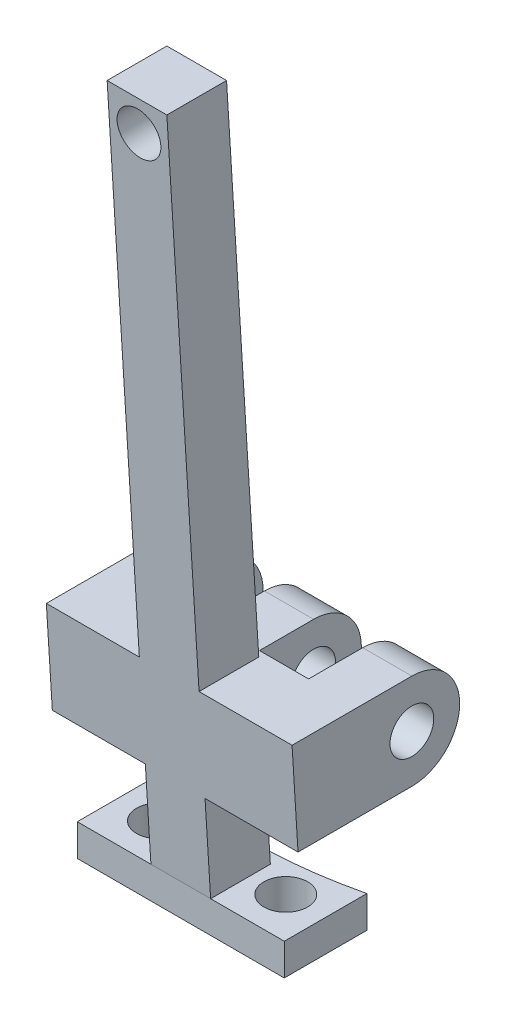
ISO-10303-21;
HEADER;
FILE_DESCRIPTION(('STEP AP214'),'2;1');
FILE_NAME('part.step','',(''),(''),'','','');
FILE_SCHEMA(('AUTOMOTIVE_DESIGN { 1 0 10303 214 1 1 1 1 }'));
ENDSEC;
DATA;
#1=APPLICATION_CONTEXT('core data for automotive mechanical design processes');
#2=APPLICATION_PROTOCOL_DEFINITION('international standard','automotive_design',2000,#1);
#3=PRODUCT_CONTEXT('',#1,'mechanical');
#4=PRODUCT('Part','Part','',(#3));
#5=PRODUCT_RELATED_PRODUCT_CATEGORY('part','',(#4));
#6=PRODUCT_DEFINITION_FORMATION('','',#4);
#7=PRODUCT_DEFINITION_CONTEXT('part definition',#1,'design');
#8=PRODUCT_DEFINITION('design','',#6,#7);
#9=PRODUCT_DEFINITION_SHAPE('','',#8);
#10=(LENGTH_UNIT() NAMED_UNIT(*) SI_UNIT(.MILLI.,.METRE.));
#11=(NAMED_UNIT(*) PLANE_ANGLE_UNIT() SI_UNIT($,.RADIAN.));
#12=(NAMED_UNIT(*) SI_UNIT($,.STERADIAN.) SOLID_ANGLE_UNIT());
#13=UNCERTAINTY_MEASURE_WITH_UNIT(LENGTH_MEASURE(1.E-05),#10,'distance_accuracy_value','');
#14=(GEOMETRIC_REPRESENTATION_CONTEXT(3) GLOBAL_UNCERTAINTY_ASSIGNED_CONTEXT((#13)) GLOBAL_UNIT_ASSIGNED_CONTEXT((#10,
#11,#12)) REPRESENTATION_CONTEXT('',''));
#15=CARTESIAN_POINT('',(0.,0.,0.));
#16=DIRECTION('',(0.,0.,1.));
#17=DIRECTION('',(1.,0.,0.));
#18=AXIS2_PLACEMENT_3D('',#15,#16,#17);
#19=CARTESIAN_POINT('',(7.28118293960535,13.63,-3.398125));
#20=DIRECTION('',(0.,0.,-1.));
#21=DIRECTION('',(0.,1.,0.));
#22=AXIS2_PLACEMENT_3D('',#19,#20,#21);
#23=PLANE('',#22);
#24=DIRECTION('',(-1.,0.,0.));
#25=VECTOR('',#24,1.);
#26=CARTESIAN_POINT('',(7.28118293960535,7.63,-3.398125));
#27=LINE('',#26,#25);
#28=CARTESIAN_POINT('',(1.875,7.63,-3.398125));
#29=VERTEX_POINT('',#28);
#30=CARTESIAN_POINT('',(1.543,7.63,-3.398125));
#31=VERTEX_POINT('',#30);
#32=EDGE_CURVE('E233',#29,#31,#27,.T.);
#33=ORIENTED_EDGE('',*,*,#32,.T.);
#34=DIRECTION('',(0.,1.,0.));
#35=VECTOR('',#34,1.);
#36=CARTESIAN_POINT('',(1.543,7.63,-3.398125));
#37=LINE('',#36,#35);
#38=CARTESIAN_POINT('',(1.543,13.63,-3.398125));
#39=VERTEX_POINT('',#38);
#40=EDGE_CURVE('E225',#31,#39,#37,.T.);
#41=ORIENTED_EDGE('',*,*,#40,.T.);
#42=DIRECTION('',(-1.,0.,0.));
#43=VECTOR('',#42,1.);
#44=CARTESIAN_POINT('',(7.28118293960535,13.63,-3.398125));
#45=LINE('',#44,#43);
#46=CARTESIAN_POINT('',(4.629,13.63,-3.398125));
#47=VERTEX_POINT('',#46);
#48=EDGE_CURVE('E81',#47,#39,#45,.T.);
#49=ORIENTED_EDGE('',*,*,#48,.F.);
#50=DIRECTION('',(0.,1.,0.));
#51=VECTOR('',#50,1.);
#52=CARTESIAN_POINT('',(4.629,7.63,-3.398125));
#53=LINE('',#52,#51);
#54=CARTESIAN_POINT('',(4.629,7.63,-3.398125));
#55=VERTEX_POINT('',#54);
#56=EDGE_CURVE('E538',#55,#47,#53,.T.);
#57=ORIENTED_EDGE('',*,*,#56,.F.);
#58=DIRECTION('',(1.,0.,0.));
#59=VECTOR('',#58,1.);
#60=CARTESIAN_POINT('',(-7.28118293960535,7.63,-3.398125));
#61=LINE('',#60,#59);
#62=EDGE_CURVE('E589',#29,#55,#61,.T.);
#63=ORIENTED_EDGE('',*,*,#62,.F.);
#64=EDGE_LOOP('',(#33,#41,#49,#57,#63));
#65=FACE_BOUND('',#64,.T.);
#66=ADVANCED_FACE('F55',(#65),#23,.T.);
#67=DIRECTION('',(0.,1.,0.));
#68=VECTOR('',#67,1.);
#69=CARTESIAN_POINT('',(-1.543,7.63,-3.398125));
#70=LINE('',#69,#68);
#71=CARTESIAN_POINT('',(-1.543,7.63,-3.398125));
#72=VERTEX_POINT('',#71);
#73=CARTESIAN_POINT('',(-1.543,13.63,-3.398125));
#74=VERTEX_POINT('',#73);
#75=EDGE_CURVE('E73',#72,#74,#70,.T.);
#76=ORIENTED_EDGE('',*,*,#75,.F.);
#77=CARTESIAN_POINT('',(-1.875,7.63,-3.398125));
#78=VERTEX_POINT('',#77);
#79=EDGE_CURVE('E610',#72,#78,#27,.T.);
#80=ORIENTED_EDGE('',*,*,#79,.T.);
#81=CARTESIAN_POINT('',(-4.629,7.63,-3.398125));
#82=VERTEX_POINT('',#81);
#83=EDGE_CURVE('E607',#78,#82,#27,.T.);
#84=ORIENTED_EDGE('',*,*,#83,.T.);
#85=DIRECTION('',(0.,1.,0.));
#86=VECTOR('',#85,1.);
#87=CARTESIAN_POINT('',(-4.629,7.63,-3.398125));
#88=LINE('',#87,#86);
#89=CARTESIAN_POINT('',(-4.629,13.63,-3.398125));
#90=VERTEX_POINT('',#89);
#91=EDGE_CURVE('E560',#82,#90,#88,.T.);
#92=ORIENTED_EDGE('',*,*,#91,.T.);
#93=EDGE_CURVE('E241',#74,#90,#45,.T.);
#94=ORIENTED_EDGE('',*,*,#93,.F.);
#95=EDGE_LOOP('',(#76,#80,#84,#92,#94));
#96=FACE_BOUND('',#95,.T.);
#97=ADVANCED_FACE('F322',(#96),#23,.T.);
#98=CARTESIAN_POINT('',(0.,0.24124513618677,-3.85992217898833));
#99=DIRECTION('',(0.,-0.0623782861551805,0.998052578482889));
#100=DIRECTION('',(0.,-0.998052578482889,-0.0623782861551805));
#101=AXIS2_PLACEMENT_3D('',#98,#99,#100);
#102=PLANE('',#101);
#103=ORIENTED_EDGE('',*,*,#32,.F.);
#104=DIRECTION('',(0.,0.998052578482889,0.0623782861551805));
#105=VECTOR('',#104,1.);
#106=CARTESIAN_POINT('',(1.875,2.,-3.75));
#107=LINE('',#106,#105);
#108=CARTESIAN_POINT('',(1.875,2.,-3.75));
#109=VERTEX_POINT('',#108);
#110=EDGE_CURVE('E260',#109,#29,#107,.T.);
#111=ORIENTED_EDGE('',*,*,#110,.F.);
#112=DIRECTION('',(-1.,0.,0.));
#113=VECTOR('',#112,1.);
#114=CARTESIAN_POINT('',(-1.875,2.,-3.75));
#115=LINE('',#114,#113);
#116=CARTESIAN_POINT('',(-1.875,2.,-3.75));
#117=VERTEX_POINT('',#116);
#118=EDGE_CURVE('E403',#109,#117,#115,.T.);
#119=ORIENTED_EDGE('',*,*,#118,.T.);
#120=DIRECTION('',(0.,0.998052578482889,0.0623782861551805));
#121=VECTOR('',#120,1.);
#122=CARTESIAN_POINT('',(-1.875,2.,-3.75));
#123=LINE('',#122,#121);
#124=EDGE_CURVE('E267',#117,#78,#123,.T.);
#125=ORIENTED_EDGE('',*,*,#124,.T.);
#126=ORIENTED_EDGE('',*,*,#79,.F.);
#127=DIRECTION('',(-1.,0.,0.));
#128=VECTOR('',#127,1.);
#129=CARTESIAN_POINT('',(1.543,7.63,-3.398125));
#130=LINE('',#129,#128);
#131=EDGE_CURVE('E529',#31,#72,#130,.T.);
#132=ORIENTED_EDGE('',*,*,#131,.F.);
#133=EDGE_LOOP('',(#103,#111,#119,#125,#126,#132));
#134=FACE_BOUND('',#133,.T.);
#135=ADVANCED_FACE('F317',(#134),#102,.F.);
#136=CARTESIAN_POINT('',(0.,44.,-1.125));
#137=DIRECTION('',(0.,-0.0623782861551805,0.998052578482889));
#138=DIRECTION('',(0.,0.998052578482889,0.0623782861551805));
#139=AXIS2_PLACEMENT_3D('',#136,#137,#138);
#140=ELLIPSE('',#139,1.37768292938043,1.375);
#141=CARTESIAN_POINT('',(0.,45.375,-1.0390625));
#142=VERTEX_POINT('',#141);
#143=EDGE_CURVE('E256',#142,#142,#140,.T.);
#144=ORIENTED_EDGE('',*,*,#143,.T.);
#145=EDGE_LOOP('',(#144));
#146=FACE_BOUND('',#145,.T.);
#147=CARTESIAN_POINT('',(1.875,13.63,-3.023125));
#148=VERTEX_POINT('',#147);
#149=CARTESIAN_POINT('',(1.875,46.,-1.));
#150=VERTEX_POINT('',#149);
#151=EDGE_CURVE('E264',#148,#150,#107,.T.);
#152=ORIENTED_EDGE('',*,*,#151,.F.);
#153=DIRECTION('',(-1.,0.,0.));
#154=VECTOR('',#153,1.);
#155=CARTESIAN_POINT('',(0.,13.63,-3.023125));
#156=LINE('',#155,#154);
#157=CARTESIAN_POINT('',(-1.875,13.63,-3.023125));
#158=VERTEX_POINT('',#157);
#159=EDGE_CURVE('E240',#148,#158,#156,.T.);
#160=ORIENTED_EDGE('',*,*,#159,.T.);
#161=CARTESIAN_POINT('',(-1.875,46.,-1.));
#162=VERTEX_POINT('',#161);
#163=EDGE_CURVE('E272',#158,#162,#123,.T.);
#164=ORIENTED_EDGE('',*,*,#163,.T.);
#165=DIRECTION('',(-1.,0.,0.));
#166=VECTOR('',#165,1.);
#167=CARTESIAN_POINT('',(-1.875,46.,-1.));
#168=LINE('',#167,#166);
#169=EDGE_CURVE('E343',#150,#162,#168,.T.);
#170=ORIENTED_EDGE('',*,*,#169,.F.);
#171=EDGE_LOOP('',(#152,#160,#164,#170));
#172=FACE_BOUND('',#171,.T.);
#173=ADVANCED_FACE('F321',(#146,#172),#102,.F.);
#174=CARTESIAN_POINT('',(1.875,0.,0.));
#175=DIRECTION('',(-1.,0.,0.));
#176=DIRECTION('',(0.,0.,1.));
#177=AXIS2_PLACEMENT_3D('',#174,#175,#176);
#178=PLANE('',#177);
#179=DIRECTION('',(0.,0.,-1.));
#180=VECTOR('',#179,1.);
#181=CARTESIAN_POINT('',(1.875,7.63,0.));
#182=LINE('',#181,#180);
#183=CARTESIAN_POINT('',(1.875,7.63,0.351875));
#184=VERTEX_POINT('',#183);
#185=EDGE_CURVE('E597',#184,#29,#182,.T.);
#186=ORIENTED_EDGE('',*,*,#185,.F.);
#187=DIRECTION('',(0.,0.998052578482889,0.0623782861551805));
#188=VECTOR('',#187,1.);
#189=CARTESIAN_POINT('',(1.875,2.,0.));
#190=LINE('',#189,#188);
#191=CARTESIAN_POINT('',(1.87499999999999,2.,0.));
#192=VERTEX_POINT('',#191);
#193=EDGE_CURVE('E271',#192,#184,#190,.T.);
#194=ORIENTED_EDGE('',*,*,#193,.F.);
#195=DIRECTION('',(0.,0.,-1.));
#196=VECTOR('',#195,1.);
#197=CARTESIAN_POINT('',(1.875,2.,0.));
#198=LINE('',#197,#196);
#199=EDGE_CURVE('E405',#192,#109,#198,.T.);
#200=ORIENTED_EDGE('',*,*,#199,.T.);
#201=ORIENTED_EDGE('',*,*,#110,.T.);
#202=EDGE_LOOP('',(#186,#194,#200,#201));
#203=FACE_BOUND('',#202,.T.);
#204=ADVANCED_FACE('F376',(#203),#178,.F.);
#205=DIRECTION('',(0.,0.,1.));
#206=VECTOR('',#205,1.);
#207=CARTESIAN_POINT('',(1.875,13.63,0.));
#208=LINE('',#207,#206);
#209=CARTESIAN_POINT('',(1.875,13.63,0.726875));
#210=VERTEX_POINT('',#209);
#211=EDGE_CURVE('E592',#148,#210,#208,.T.);
#212=ORIENTED_EDGE('',*,*,#211,.F.);
#213=ORIENTED_EDGE('',*,*,#151,.T.);
#214=DIRECTION('',(0.,0.,-1.));
#215=VECTOR('',#214,1.);
#216=CARTESIAN_POINT('',(1.875,46.,2.75));
#217=LINE('',#216,#215);
#218=CARTESIAN_POINT('',(1.875,46.,2.75));
#219=VERTEX_POINT('',#218);
#220=EDGE_CURVE('E346',#219,#150,#217,.T.);
#221=ORIENTED_EDGE('',*,*,#220,.F.);
#222=EDGE_CURVE('E59',#210,#219,#190,.T.);
#223=ORIENTED_EDGE('',*,*,#222,.F.);
#224=EDGE_LOOP('',(#212,#213,#221,#223));
#225=FACE_BOUND('',#224,.T.);
#226=ADVANCED_FACE('F436',(#225),#178,.F.);
#227=CARTESIAN_POINT('',(-1.875,0.,0.));
#228=DIRECTION('',(1.,0.,0.));
#229=DIRECTION('',(0.,0.,-1.));
#230=AXIS2_PLACEMENT_3D('',#227,#228,#229);
#231=PLANE('',#230);
#232=DIRECTION('',(0.,0.998052578482889,0.0623782861551805));
#233=VECTOR('',#232,1.);
#234=CARTESIAN_POINT('',(-1.875,2.,0.));
#235=LINE('',#234,#233);
#236=CARTESIAN_POINT('',(-1.875,2.,0.));
#237=VERTEX_POINT('',#236);
#238=CARTESIAN_POINT('',(-1.875,7.63,0.351875));
#239=VERTEX_POINT('',#238);
#240=EDGE_CURVE('E274',#237,#239,#235,.T.);
#241=ORIENTED_EDGE('',*,*,#240,.T.);
#242=DIRECTION('',(0.,0.,-1.));
#243=VECTOR('',#242,1.);
#244=CARTESIAN_POINT('',(-1.875,7.63,0.));
#245=LINE('',#244,#243);
#246=EDGE_CURVE('E252',#239,#78,#245,.T.);
#247=ORIENTED_EDGE('',*,*,#246,.T.);
#248=ORIENTED_EDGE('',*,*,#124,.F.);
#249=DIRECTION('',(0.,0.,1.));
#250=VECTOR('',#249,1.);
#251=CARTESIAN_POINT('',(-1.875,2.,-3.75));
#252=LINE('',#251,#250);
#253=EDGE_CURVE('E259',#117,#237,#252,.T.);
#254=ORIENTED_EDGE('',*,*,#253,.T.);
#255=EDGE_LOOP('',(#241,#247,#248,#254));
#256=FACE_BOUND('',#255,.T.);
#257=ADVANCED_FACE('F314',(#256),#231,.F.);
#258=CARTESIAN_POINT('',(6.5,2.,0.));
#259=DIRECTION('',(-1.,0.,0.));
#260=DIRECTION('',(0.,0.,1.));
#261=AXIS2_PLACEMENT_3D('',#258,#259,#260);
#262=PLANE('',#261);
#263=DIRECTION('',(0.,0.,-1.));
#264=VECTOR('',#263,1.);
#265=CARTESIAN_POINT('',(6.5,0.,0.));
#266=LINE('',#265,#264);
#267=CARTESIAN_POINT('',(6.5,0.,0.));
#268=VERTEX_POINT('',#267);
#269=CARTESIAN_POINT('',(6.5,0.,-5.19));
#270=VERTEX_POINT('',#269);
#271=EDGE_CURVE('E671',#268,#270,#266,.T.);
#272=ORIENTED_EDGE('',*,*,#271,.T.);
#273=DIRECTION('',(0.,-1.,0.));
#274=VECTOR('',#273,1.);
#275=CARTESIAN_POINT('',(6.5,2.,-5.19));
#276=LINE('',#275,#274);
#277=CARTESIAN_POINT('',(6.5,2.,-5.19));
#278=VERTEX_POINT('',#277);
#279=EDGE_CURVE('E12',#278,#270,#276,.T.);
#280=ORIENTED_EDGE('',*,*,#279,.F.);
#281=DIRECTION('',(0.,0.,-1.));
#282=VECTOR('',#281,1.);
#283=CARTESIAN_POINT('',(6.5,2.,0.));
#284=LINE('',#283,#282);
#285=CARTESIAN_POINT('',(6.5,2.,0.));
#286=VERTEX_POINT('',#285);
#287=EDGE_CURVE('E686',#286,#278,#284,.T.);
#288=ORIENTED_EDGE('',*,*,#287,.F.);
#289=DIRECTION('',(0.,-1.,0.));
#290=VECTOR('',#289,1.);
#291=CARTESIAN_POINT('',(6.5,2.,0.));
#292=LINE('',#291,#290);
#293=EDGE_CURVE('E659',#286,#268,#292,.T.);
#294=ORIENTED_EDGE('',*,*,#293,.T.);
#295=EDGE_LOOP('',(#272,#280,#288,#294));
#296=FACE_BOUND('',#295,.T.);
#297=ADVANCED_FACE('F57',(#296),#262,.F.);
#298=CARTESIAN_POINT('',(6.5,2.,-5.19));
#299=CARTESIAN_POINT('',(0.,2.,-3.63));
#300=CARTESIAN_POINT('',(-6.5,2.,-5.19));
#301=B_SPLINE_CURVE_WITH_KNOTS('',2,(#298,#299,#300),.UNSPECIFIED.,.F.,.F.,(3,3),(0.,1.),.UNSPECIFIED.);
#302=DIRECTION('',(0.,-1.,0.));
#303=VECTOR('',#302,1.);
#304=SURFACE_OF_LINEAR_EXTRUSION('',#301,#303);
#305=CARTESIAN_POINT('',(6.5,0.,-5.19));
#306=CARTESIAN_POINT('',(0.,0.,-3.63));
#307=CARTESIAN_POINT('',(-6.5,0.,-5.19));
#308=B_SPLINE_CURVE_WITH_KNOTS('',2,(#305,#306,#307),.UNSPECIFIED.,.F.,.F.,(3,3),(0.,1.),.UNSPECIFIED.);
#309=CARTESIAN_POINT('',(-6.5,0.,-5.19));
#310=VERTEX_POINT('',#309);
#311=EDGE_CURVE('E675',#270,#310,#308,.T.);
#312=ORIENTED_EDGE('',*,*,#311,.T.);
#313=DIRECTION('',(0.,-1.,0.));
#314=VECTOR('',#313,1.);
#315=CARTESIAN_POINT('',(-6.5,2.,-5.19));
#316=LINE('',#315,#314);
#317=CARTESIAN_POINT('',(-6.5,2.,-5.19));
#318=VERTEX_POINT('',#317);
#319=EDGE_CURVE('E65',#318,#310,#316,.T.);
#320=ORIENTED_EDGE('',*,*,#319,.F.);
#321=EDGE_CURVE('E665',#278,#318,#301,.T.);
#322=ORIENTED_EDGE('',*,*,#321,.F.);
#323=ORIENTED_EDGE('',*,*,#279,.T.);
#324=EDGE_LOOP('',(#312,#320,#322,#323));
#325=FACE_BOUND('',#324,.T.);
#326=ADVANCED_FACE('F713',(#325),#304,.F.);
#327=CARTESIAN_POINT('',(-6.5,2.,0.));
#328=DIRECTION('',(1.,0.,0.));
#329=DIRECTION('',(0.,0.,-1.));
#330=AXIS2_PLACEMENT_3D('',#327,#328,#329);
#331=PLANE('',#330);
#332=DIRECTION('',(0.,0.,1.));
#333=VECTOR('',#332,1.);
#334=CARTESIAN_POINT('',(-6.5,0.,0.));
#335=LINE('',#334,#333);
#336=CARTESIAN_POINT('',(-6.5,0.,0.));
#337=VERTEX_POINT('',#336);
#338=EDGE_CURVE('E679',#310,#337,#335,.T.);
#339=ORIENTED_EDGE('',*,*,#338,.T.);
#340=DIRECTION('',(0.,-1.,0.));
#341=VECTOR('',#340,1.);
#342=CARTESIAN_POINT('',(-6.5,2.,0.));
#343=LINE('',#342,#341);
#344=CARTESIAN_POINT('',(-6.5,2.,0.));
#345=VERTEX_POINT('',#344);
#346=EDGE_CURVE('E688',#345,#337,#343,.T.);
#347=ORIENTED_EDGE('',*,*,#346,.F.);
#348=DIRECTION('',(0.,0.,1.));
#349=VECTOR('',#348,1.);
#350=CARTESIAN_POINT('',(-6.5,2.,0.));
#351=LINE('',#350,#349);
#352=EDGE_CURVE('E662',#318,#345,#351,.T.);
#353=ORIENTED_EDGE('',*,*,#352,.F.);
#354=ORIENTED_EDGE('',*,*,#319,.T.);
#355=EDGE_LOOP('',(#339,#347,#353,#354));
#356=FACE_BOUND('',#355,.T.);
#357=ADVANCED_FACE('F695',(#356),#331,.F.);
#358=CARTESIAN_POINT('',(-6.5,2.,0.));
#359=DIRECTION('',(0.,0.,-1.));
#360=DIRECTION('',(-1.,0.,0.));
#361=AXIS2_PLACEMENT_3D('',#358,#359,#360);
#362=PLANE('',#361);
#363=DIRECTION('',(1.,0.,0.));
#364=VECTOR('',#363,1.);
#365=CARTESIAN_POINT('',(-6.5,0.,0.));
#366=LINE('',#365,#364);
#367=EDGE_CURVE('E684',#337,#268,#366,.T.);
#368=ORIENTED_EDGE('',*,*,#367,.T.);
#369=ORIENTED_EDGE('',*,*,#293,.F.);
#370=DIRECTION('',(1.,0.,0.));
#371=VECTOR('',#370,1.);
#372=CARTESIAN_POINT('',(-6.5,2.,0.));
#373=LINE('',#372,#371);
#374=EDGE_CURVE('E657',#192,#286,#373,.T.);
#375=ORIENTED_EDGE('',*,*,#374,.F.);
#376=DIRECTION('',(1.,0.,0.));
#377=VECTOR('',#376,1.);
#378=CARTESIAN_POINT('',(-1.875,2.,0.));
#379=LINE('',#378,#377);
#380=EDGE_CURVE('E411',#237,#192,#379,.T.);
#381=ORIENTED_EDGE('',*,*,#380,.F.);
#382=EDGE_CURVE('E651',#345,#237,#373,.T.);
#383=ORIENTED_EDGE('',*,*,#382,.F.);
#384=ORIENTED_EDGE('',*,*,#346,.T.);
#385=EDGE_LOOP('',(#368,#369,#375,#381,#383,#384));
#386=FACE_BOUND('',#385,.T.);
#387=ADVANCED_FACE('F654',(#386),#362,.F.);
#388=CARTESIAN_POINT('',(0.,2.,-4.41));
#389=DIRECTION('',(0.,-1.,0.));
#390=DIRECTION('',(0.,0.,-1.));
#391=AXIS2_PLACEMENT_3D('',#388,#389,#390);
#392=PLANE('',#391);
#393=CARTESIAN_POINT('',(-4.,2.,-2.595));
#394=DIRECTION('',(0.,1.,0.));
#395=DIRECTION('',(0.,0.,1.));
#396=AXIS2_PLACEMENT_3D('',#393,#394,#395);
#397=CIRCLE('',#396,1.375);
#398=CARTESIAN_POINT('',(-4.,2.,-1.22));
#399=VERTEX_POINT('',#398);
#400=EDGE_CURVE('E739',#399,#399,#397,.T.);
#401=ORIENTED_EDGE('',*,*,#400,.F.);
#402=EDGE_LOOP('',(#401));
#403=FACE_BOUND('',#402,.T.);
#404=CARTESIAN_POINT('',(4.,2.,-2.595));
#405=DIRECTION('',(0.,1.,0.));
#406=DIRECTION('',(0.,0.,1.));
#407=AXIS2_PLACEMENT_3D('',#404,#405,#406);
#408=CIRCLE('',#407,1.375);
#409=CARTESIAN_POINT('',(4.,2.,-1.22));
#410=VERTEX_POINT('',#409);
#411=EDGE_CURVE('E737',#410,#410,#408,.T.);
#412=ORIENTED_EDGE('',*,*,#411,.F.);
#413=EDGE_LOOP('',(#412));
#414=FACE_BOUND('',#413,.T.);
#415=ORIENTED_EDGE('',*,*,#382,.T.);
#416=ORIENTED_EDGE('',*,*,#253,.F.);
#417=ORIENTED_EDGE('',*,*,#118,.F.);
#418=ORIENTED_EDGE('',*,*,#199,.F.);
#419=ORIENTED_EDGE('',*,*,#374,.T.);
#420=ORIENTED_EDGE('',*,*,#287,.T.);
#421=ORIENTED_EDGE('',*,*,#321,.T.);
#422=ORIENTED_EDGE('',*,*,#352,.T.);
#423=EDGE_LOOP('',(#415,#416,#417,#418,#419,#420,#421,#422));
#424=FACE_BOUND('',#423,.T.);
#425=ADVANCED_FACE('F648',(#403,#414,#424),#392,.F.);
#426=CARTESIAN_POINT('',(0.,0.,-4.41));
#427=DIRECTION('',(0.,-1.,0.));
#428=DIRECTION('',(0.,0.,-1.));
#429=AXIS2_PLACEMENT_3D('',#426,#427,#428);
#430=PLANE('',#429);
#431=CARTESIAN_POINT('',(-4.,0.,-2.595));
#432=DIRECTION('',(0.,1.,0.));
#433=DIRECTION('',(0.,0.,1.));
#434=AXIS2_PLACEMENT_3D('',#431,#432,#433);
#435=CIRCLE('',#434,1.375);
#436=CARTESIAN_POINT('',(-4.,0.,-1.22));
#437=VERTEX_POINT('',#436);
#438=EDGE_CURVE('E365',#437,#437,#435,.T.);
#439=ORIENTED_EDGE('',*,*,#438,.T.);
#440=EDGE_LOOP('',(#439));
#441=FACE_BOUND('',#440,.T.);
#442=CARTESIAN_POINT('',(4.,0.,-2.595));
#443=DIRECTION('',(0.,1.,0.));
#444=DIRECTION('',(0.,0.,1.));
#445=AXIS2_PLACEMENT_3D('',#442,#443,#444);
#446=CIRCLE('',#445,1.375);
#447=CARTESIAN_POINT('',(4.,0.,-1.22));
#448=VERTEX_POINT('',#447);
#449=EDGE_CURVE('E394',#448,#448,#446,.T.);
#450=ORIENTED_EDGE('',*,*,#449,.T.);
#451=EDGE_LOOP('',(#450));
#452=FACE_BOUND('',#451,.T.);
#453=ORIENTED_EDGE('',*,*,#271,.F.);
#454=ORIENTED_EDGE('',*,*,#367,.F.);
#455=ORIENTED_EDGE('',*,*,#338,.F.);
#456=ORIENTED_EDGE('',*,*,#311,.F.);
#457=EDGE_LOOP('',(#453,#454,#455,#456));
#458=FACE_BOUND('',#457,.T.);
#459=ADVANCED_FACE('F701',(#441,#452,#458),#430,.T.);
#460=CARTESIAN_POINT('',(4.,0.,-2.595));
#461=DIRECTION('',(0.,1.,0.));
#462=DIRECTION('',(0.,0.,1.));
#463=AXIS2_PLACEMENT_3D('',#460,#461,#462);
#464=CYLINDRICAL_SURFACE('',#463,1.375);
#465=ORIENTED_EDGE('',*,*,#449,.F.);
#466=EDGE_LOOP('',(#465));
#467=FACE_BOUND('',#466,.T.);
#468=ORIENTED_EDGE('',*,*,#411,.T.);
#469=EDGE_LOOP('',(#468));
#470=FACE_BOUND('',#469,.T.);
#471=ADVANCED_FACE('F722',(#467,#470),#464,.F.);
#472=CARTESIAN_POINT('',(-4.,0.,-2.595));
#473=DIRECTION('',(0.,1.,0.));
#474=DIRECTION('',(0.,0.,1.));
#475=AXIS2_PLACEMENT_3D('',#472,#473,#474);
#476=CYLINDRICAL_SURFACE('',#475,1.375);
#477=ORIENTED_EDGE('',*,*,#438,.F.);
#478=EDGE_LOOP('',(#477));
#479=FACE_BOUND('',#478,.T.);
#480=ORIENTED_EDGE('',*,*,#400,.T.);
#481=EDGE_LOOP('',(#480));
#482=FACE_BOUND('',#481,.T.);
#483=ADVANCED_FACE('F375',(#479,#482),#476,.F.);
#484=CARTESIAN_POINT('',(0.,46.,0.));
#485=DIRECTION('',(0.,1.,0.));
#486=DIRECTION('',(0.,0.,1.));
#487=AXIS2_PLACEMENT_3D('',#484,#485,#486);
#488=PLANE('',#487);
#489=DIRECTION('',(1.,0.,0.));
#490=VECTOR('',#489,1.);
#491=CARTESIAN_POINT('',(-1.875,46.,2.75));
#492=LINE('',#491,#490);
#493=CARTESIAN_POINT('',(-1.875,46.,2.75));
#494=VERTEX_POINT('',#493);
#495=EDGE_CURVE('E263',#494,#219,#492,.T.);
#496=ORIENTED_EDGE('',*,*,#495,.T.);
#497=ORIENTED_EDGE('',*,*,#220,.T.);
#498=ORIENTED_EDGE('',*,*,#169,.T.);
#499=DIRECTION('',(0.,0.,1.));
#500=VECTOR('',#499,1.);
#501=CARTESIAN_POINT('',(-1.875,46.,-1.));
#502=LINE('',#501,#500);
#503=EDGE_CURVE('E294',#162,#494,#502,.T.);
#504=ORIENTED_EDGE('',*,*,#503,.T.);
#505=EDGE_LOOP('',(#496,#497,#498,#504));
#506=FACE_BOUND('',#505,.T.);
#507=ADVANCED_FACE('F313',(#506),#488,.T.);
#508=ORIENTED_EDGE('',*,*,#163,.F.);
#509=DIRECTION('',(0.,0.,1.));
#510=VECTOR('',#509,1.);
#511=CARTESIAN_POINT('',(-1.875,13.63,0.));
#512=LINE('',#511,#510);
#513=CARTESIAN_POINT('',(-1.875,13.63,0.726875));
#514=VERTEX_POINT('',#513);
#515=EDGE_CURVE('E244',#158,#514,#512,.T.);
#516=ORIENTED_EDGE('',*,*,#515,.T.);
#517=EDGE_CURVE('E275',#514,#494,#235,.T.);
#518=ORIENTED_EDGE('',*,*,#517,.T.);
#519=ORIENTED_EDGE('',*,*,#503,.F.);
#520=EDGE_LOOP('',(#508,#516,#518,#519));
#521=FACE_BOUND('',#520,.T.);
#522=ADVANCED_FACE('F302',(#521),#231,.F.);
#523=CARTESIAN_POINT('',(0.,0.00778210116731518,-0.124513618677043));
#524=DIRECTION('',(0.,0.0623782861551805,-0.998052578482889));
#525=DIRECTION('',(0.,0.998052578482889,0.0623782861551805));
#526=AXIS2_PLACEMENT_3D('',#523,#524,#525);
#527=PLANE('',#526);
#528=ORIENTED_EDGE('',*,*,#193,.T.);
#529=DIRECTION('',(1.,0.,0.));
#530=VECTOR('',#529,1.);
#531=CARTESIAN_POINT('',(-7.28118293960535,7.63,0.351874999999999));
#532=LINE('',#531,#530);
#533=CARTESIAN_POINT('',(7.715,7.63,0.351875000000001));
#534=VERTEX_POINT('',#533);
#535=EDGE_CURVE('E593',#184,#534,#532,.T.);
#536=ORIENTED_EDGE('',*,*,#535,.T.);
#537=DIRECTION('',(0.,0.998052578482889,0.0623782861551805));
#538=VECTOR('',#537,1.);
#539=CARTESIAN_POINT('',(7.715,7.63,0.351875000000001));
#540=LINE('',#539,#538);
#541=CARTESIAN_POINT('',(7.715,13.63,0.726875));
#542=VERTEX_POINT('',#541);
#543=EDGE_CURVE('E582',#534,#542,#540,.T.);
#544=ORIENTED_EDGE('',*,*,#543,.T.);
#545=DIRECTION('',(1.,0.,0.));
#546=VECTOR('',#545,1.);
#547=CARTESIAN_POINT('',(-7.28118293960535,13.63,0.726874999999999));
#548=LINE('',#547,#546);
#549=EDGE_CURVE('E588',#210,#542,#548,.T.);
#550=ORIENTED_EDGE('',*,*,#549,.F.);
#551=ORIENTED_EDGE('',*,*,#222,.T.);
#552=ORIENTED_EDGE('',*,*,#495,.F.);
#553=ORIENTED_EDGE('',*,*,#517,.F.);
#554=DIRECTION('',(-1.,0.,0.));
#555=VECTOR('',#554,1.);
#556=CARTESIAN_POINT('',(7.28118293960535,13.63,0.726874999999999));
#557=LINE('',#556,#555);
#558=CARTESIAN_POINT('',(-7.715,13.63,0.726875));
#559=VERTEX_POINT('',#558);
#560=EDGE_CURVE('E246',#514,#559,#557,.T.);
#561=ORIENTED_EDGE('',*,*,#560,.T.);
#562=DIRECTION('',(0.,0.998052578482889,0.0623782861551805));
#563=VECTOR('',#562,1.);
#564=CARTESIAN_POINT('',(-7.715,7.63,0.351875000000001));
#565=LINE('',#564,#563);
#566=CARTESIAN_POINT('',(-7.715,7.63,0.351875000000001));
#567=VERTEX_POINT('',#566);
#568=EDGE_CURVE('E605',#567,#559,#565,.T.);
#569=ORIENTED_EDGE('',*,*,#568,.F.);
#570=DIRECTION('',(-1.,0.,0.));
#571=VECTOR('',#570,1.);
#572=CARTESIAN_POINT('',(7.28118293960535,7.63,0.351874999999999));
#573=LINE('',#572,#571);
#574=EDGE_CURVE('E608',#239,#567,#573,.T.);
#575=ORIENTED_EDGE('',*,*,#574,.F.);
#576=ORIENTED_EDGE('',*,*,#240,.F.);
#577=ORIENTED_EDGE('',*,*,#380,.T.);
#578=EDGE_LOOP('',(#528,#536,#544,#550,#551,#552,#553,#561,#569,#575,#576,#577));
#579=FACE_BOUND('',#578,.T.);
#580=CARTESIAN_POINT('',(0.,44.,2.625));
#581=DIRECTION('',(0.,0.0623782861551805,-0.998052578482889));
#582=DIRECTION('',(0.,0.998052578482889,0.0623782861551805));
#583=AXIS2_PLACEMENT_3D('',#580,#581,#582);
#584=ELLIPSE('',#583,1.37768292938043,1.375);
#585=CARTESIAN_POINT('',(0.,45.375,2.7109375));
#586=VERTEX_POINT('',#585);
#587=EDGE_CURVE('E255',#586,#586,#584,.T.);
#588=ORIENTED_EDGE('',*,*,#587,.T.);
#589=EDGE_LOOP('',(#588));
#590=FACE_BOUND('',#589,.T.);
#591=ADVANCED_FACE('F312',(#579,#590),#527,.F.);
#592=CARTESIAN_POINT('',(0.,44.,-5.19));
#593=DIRECTION('',(0.,0.,1.));
#594=DIRECTION('',(1.,0.,0.));
#595=AXIS2_PLACEMENT_3D('',#592,#593,#594);
#596=CYLINDRICAL_SURFACE('',#595,1.375);
#597=ORIENTED_EDGE('',*,*,#587,.F.);
#598=EDGE_LOOP('',(#597));
#599=FACE_BOUND('',#598,.T.);
#600=ORIENTED_EDGE('',*,*,#143,.F.);
#601=EDGE_LOOP('',(#600));
#602=FACE_BOUND('',#601,.T.);
#603=ADVANCED_FACE('F315',(#599,#602),#596,.F.);
#604=CARTESIAN_POINT('',(7.28118293960535,7.63,-3.398125));
#605=DIRECTION('',(0.,-1.,0.));
#606=DIRECTION('',(1.,0.,0.));
#607=AXIS2_PLACEMENT_3D('',#604,#605,#606);
#608=PLANE('',#607);
#609=ORIENTED_EDGE('',*,*,#246,.F.);
#610=ORIENTED_EDGE('',*,*,#574,.T.);
#611=DIRECTION('',(0.,0.,1.));
#612=VECTOR('',#611,1.);
#613=CARTESIAN_POINT('',(-7.715,7.63,-3.398125));
#614=LINE('',#613,#612);
#615=CARTESIAN_POINT('',(-7.715,7.63,-6.798125));
#616=VERTEX_POINT('',#615);
#617=EDGE_CURVE('E602',#616,#567,#614,.T.);
#618=ORIENTED_EDGE('',*,*,#617,.F.);
#619=DIRECTION('',(-1.,0.,0.));
#620=VECTOR('',#619,1.);
#621=CARTESIAN_POINT('',(-4.629,7.63,-6.798125));
#622=LINE('',#621,#620);
#623=CARTESIAN_POINT('',(-4.629,7.63,-6.798125));
#624=VERTEX_POINT('',#623);
#625=EDGE_CURVE('E575',#624,#616,#622,.T.);
#626=ORIENTED_EDGE('',*,*,#625,.F.);
#627=DIRECTION('',(0.,0.,1.));
#628=VECTOR('',#627,1.);
#629=CARTESIAN_POINT('',(-4.629,7.63,-3.398125));
#630=LINE('',#629,#628);
#631=EDGE_CURVE('E569',#624,#82,#630,.T.);
#632=ORIENTED_EDGE('',*,*,#631,.T.);
#633=ORIENTED_EDGE('',*,*,#83,.F.);
#634=EDGE_LOOP('',(#609,#610,#618,#626,#632,#633));
#635=FACE_BOUND('',#634,.T.);
#636=ADVANCED_FACE('F429',(#635),#608,.T.);
#637=CARTESIAN_POINT('',(7.28118293960535,13.63,0.726874999999999));
#638=DIRECTION('',(0.,1.,0.));
#639=DIRECTION('',(0.,0.,1.));
#640=AXIS2_PLACEMENT_3D('',#637,#638,#639);
#641=PLANE('',#640);
#642=ORIENTED_EDGE('',*,*,#515,.F.);
#643=ORIENTED_EDGE('',*,*,#159,.F.);
#644=ORIENTED_EDGE('',*,*,#211,.T.);
#645=ORIENTED_EDGE('',*,*,#549,.T.);
#646=DIRECTION('',(0.,0.,-1.));
#647=VECTOR('',#646,1.);
#648=CARTESIAN_POINT('',(7.715,13.63,0.726875));
#649=LINE('',#648,#647);
#650=CARTESIAN_POINT('',(7.715,13.63,-6.798125));
#651=VERTEX_POINT('',#650);
#652=EDGE_CURVE('E578',#542,#651,#649,.T.);
#653=ORIENTED_EDGE('',*,*,#652,.T.);
#654=DIRECTION('',(-1.,0.,0.));
#655=VECTOR('',#654,1.);
#656=CARTESIAN_POINT('',(7.715,13.63,-6.798125));
#657=LINE('',#656,#655);
#658=CARTESIAN_POINT('',(4.629,13.63,-6.798125));
#659=VERTEX_POINT('',#658);
#660=EDGE_CURVE('E515',#651,#659,#657,.T.);
#661=ORIENTED_EDGE('',*,*,#660,.T.);
#662=DIRECTION('',(0.,0.,-1.));
#663=VECTOR('',#662,1.);
#664=CARTESIAN_POINT('',(4.629,13.63,-6.798125));
#665=LINE('',#664,#663);
#666=EDGE_CURVE('E238',#47,#659,#665,.T.);
#667=ORIENTED_EDGE('',*,*,#666,.F.);
#668=ORIENTED_EDGE('',*,*,#48,.T.);
#669=DIRECTION('',(0.,0.,-1.));
#670=VECTOR('',#669,1.);
#671=CARTESIAN_POINT('',(1.543,13.63,-6.798125));
#672=LINE('',#671,#670);
#673=CARTESIAN_POINT('',(1.543,13.63,-6.798125));
#674=VERTEX_POINT('',#673);
#675=EDGE_CURVE('E222',#39,#674,#672,.T.);
#676=ORIENTED_EDGE('',*,*,#675,.T.);
#677=DIRECTION('',(-1.,0.,0.));
#678=VECTOR('',#677,1.);
#679=CARTESIAN_POINT('',(1.543,13.63,-6.798125));
#680=LINE('',#679,#678);
#681=CARTESIAN_POINT('',(-1.543,13.63,-6.798125));
#682=VERTEX_POINT('',#681);
#683=EDGE_CURVE('E521',#674,#682,#680,.T.);
#684=ORIENTED_EDGE('',*,*,#683,.T.);
#685=DIRECTION('',(0.,0.,-1.));
#686=VECTOR('',#685,1.);
#687=CARTESIAN_POINT('',(-1.543,13.63,-6.798125));
#688=LINE('',#687,#686);
#689=EDGE_CURVE('E523',#74,#682,#688,.T.);
#690=ORIENTED_EDGE('',*,*,#689,.F.);
#691=ORIENTED_EDGE('',*,*,#93,.T.);
#692=DIRECTION('',(0.,0.,-1.));
#693=VECTOR('',#692,1.);
#694=CARTESIAN_POINT('',(-4.629,13.63,-6.798125));
#695=LINE('',#694,#693);
#696=CARTESIAN_POINT('',(-4.629,13.63,-6.798125));
#697=VERTEX_POINT('',#696);
#698=EDGE_CURVE('E563',#90,#697,#695,.T.);
#699=ORIENTED_EDGE('',*,*,#698,.T.);
#700=DIRECTION('',(-1.,0.,0.));
#701=VECTOR('',#700,1.);
#702=CARTESIAN_POINT('',(-4.629,13.63,-6.798125));
#703=LINE('',#702,#701);
#704=CARTESIAN_POINT('',(-7.715,13.63,-6.798125));
#705=VERTEX_POINT('',#704);
#706=EDGE_CURVE('E572',#697,#705,#703,.T.);
#707=ORIENTED_EDGE('',*,*,#706,.T.);
#708=DIRECTION('',(0.,0.,-1.));
#709=VECTOR('',#708,1.);
#710=CARTESIAN_POINT('',(-7.715,13.63,0.726875));
#711=LINE('',#710,#709);
#712=EDGE_CURVE('E600',#559,#705,#711,.T.);
#713=ORIENTED_EDGE('',*,*,#712,.F.);
#714=ORIENTED_EDGE('',*,*,#560,.F.);
#715=EDGE_LOOP('',(#642,#643,#644,#645,#653,#661,#667,#668,#676,#684,#690,#691,#699,#707,#713,#714));
#716=FACE_BOUND('',#715,.T.);
#717=ADVANCED_FACE('F236',(#716),#641,.T.);
#718=CARTESIAN_POINT('',(-7.715,0.,0.));
#719=DIRECTION('',(-1.,0.,0.));
#720=DIRECTION('',(0.,0.,1.));
#721=AXIS2_PLACEMENT_3D('',#718,#719,#720);
#722=PLANE('',#721);
#723=ORIENTED_EDGE('',*,*,#712,.T.);
#724=CARTESIAN_POINT('',(-7.715,10.63,-6.798125));
#725=DIRECTION('',(-1.,0.,0.));
#726=DIRECTION('',(0.,0.,1.));
#727=AXIS2_PLACEMENT_3D('',#724,#725,#726);
#728=CIRCLE('',#727,3.);
#729=EDGE_CURVE('E557',#705,#616,#728,.T.);
#730=ORIENTED_EDGE('',*,*,#729,.T.);
#731=ORIENTED_EDGE('',*,*,#617,.T.);
#732=ORIENTED_EDGE('',*,*,#568,.T.);
#733=EDGE_LOOP('',(#723,#730,#731,#732));
#734=FACE_BOUND('',#733,.T.);
#735=CARTESIAN_POINT('',(-7.715,10.63,-6.798125));
#736=DIRECTION('',(-1.,0.,0.));
#737=DIRECTION('',(0.,0.,1.));
#738=AXIS2_PLACEMENT_3D('',#735,#736,#737);
#739=CIRCLE('',#738,1.375);
#740=CARTESIAN_POINT('',(-7.715,10.63,-5.423125));
#741=VERTEX_POINT('',#740);
#742=EDGE_CURVE('E531',#741,#741,#739,.T.);
#743=ORIENTED_EDGE('',*,*,#742,.F.);
#744=EDGE_LOOP('',(#743));
#745=FACE_BOUND('',#744,.T.);
#746=ADVANCED_FACE('F450',(#734,#745),#722,.T.);
#747=CARTESIAN_POINT('',(-7.28118293960535,7.63,-3.398125));
#748=DIRECTION('',(0.,1.,0.));
#749=DIRECTION('',(-1.,0.,0.));
#750=AXIS2_PLACEMENT_3D('',#747,#748,#749);
#751=PLANE('',#750);
#752=ORIENTED_EDGE('',*,*,#535,.F.);
#753=ORIENTED_EDGE('',*,*,#185,.T.);
#754=ORIENTED_EDGE('',*,*,#62,.T.);
#755=DIRECTION('',(0.,0.,1.));
#756=VECTOR('',#755,1.);
#757=CARTESIAN_POINT('',(4.629,7.63,-3.398125));
#758=LINE('',#757,#756);
#759=CARTESIAN_POINT('',(4.629,7.63,-6.798125));
#760=VERTEX_POINT('',#759);
#761=EDGE_CURVE('E545',#760,#55,#758,.T.);
#762=ORIENTED_EDGE('',*,*,#761,.F.);
#763=DIRECTION('',(-1.,0.,0.));
#764=VECTOR('',#763,1.);
#765=CARTESIAN_POINT('',(7.715,7.63,-6.798125));
#766=LINE('',#765,#764);
#767=CARTESIAN_POINT('',(7.715,7.63,-6.798125));
#768=VERTEX_POINT('',#767);
#769=EDGE_CURVE('E512',#768,#760,#766,.T.);
#770=ORIENTED_EDGE('',*,*,#769,.F.);
#771=DIRECTION('',(0.,0.,1.));
#772=VECTOR('',#771,1.);
#773=CARTESIAN_POINT('',(7.715,7.63,-3.398125));
#774=LINE('',#773,#772);
#775=EDGE_CURVE('E585',#768,#534,#774,.T.);
#776=ORIENTED_EDGE('',*,*,#775,.T.);
#777=EDGE_LOOP('',(#752,#753,#754,#762,#770,#776));
#778=FACE_BOUND('',#777,.T.);
#779=ADVANCED_FACE('F453',(#778),#751,.F.);
#780=CARTESIAN_POINT('',(7.715,0.,0.));
#781=DIRECTION('',(1.,0.,0.));
#782=DIRECTION('',(0.,0.,1.));
#783=AXIS2_PLACEMENT_3D('',#780,#781,#782);
#784=PLANE('',#783);
#785=ORIENTED_EDGE('',*,*,#652,.F.);
#786=ORIENTED_EDGE('',*,*,#543,.F.);
#787=ORIENTED_EDGE('',*,*,#775,.F.);
#788=CARTESIAN_POINT('',(7.715,10.63,-6.798125));
#789=DIRECTION('',(-1.,0.,0.));
#790=DIRECTION('',(0.,0.,1.));
#791=AXIS2_PLACEMENT_3D('',#788,#789,#790);
#792=CIRCLE('',#791,3.);
#793=EDGE_CURVE('E542',#651,#768,#792,.T.);
#794=ORIENTED_EDGE('',*,*,#793,.F.);
#795=EDGE_LOOP('',(#785,#786,#787,#794));
#796=FACE_BOUND('',#795,.T.);
#797=CARTESIAN_POINT('',(7.715,10.63,-6.798125));
#798=DIRECTION('',(-1.,0.,0.));
#799=DIRECTION('',(0.,0.,1.));
#800=AXIS2_PLACEMENT_3D('',#797,#798,#799);
#801=CIRCLE('',#800,1.375);
#802=CARTESIAN_POINT('',(7.715,10.63,-5.423125));
#803=VERTEX_POINT('',#802);
#804=EDGE_CURVE('E535',#803,#803,#801,.T.);
#805=ORIENTED_EDGE('',*,*,#804,.T.);
#806=EDGE_LOOP('',(#805));
#807=FACE_BOUND('',#806,.T.);
#808=ADVANCED_FACE('F457',(#796,#807),#784,.T.);
#809=CARTESIAN_POINT('',(-4.629,10.63,-6.798125));
#810=DIRECTION('',(-1.,0.,0.));
#811=DIRECTION('',(0.,0.,1.));
#812=AXIS2_PLACEMENT_3D('',#809,#810,#811);
#813=CYLINDRICAL_SURFACE('',#812,3.);
#814=ORIENTED_EDGE('',*,*,#729,.F.);
#815=ORIENTED_EDGE('',*,*,#706,.F.);
#816=CARTESIAN_POINT('',(-4.629,10.63,-6.798125));
#817=DIRECTION('',(-1.,0.,0.));
#818=DIRECTION('',(0.,0.,1.));
#819=AXIS2_PLACEMENT_3D('',#816,#817,#818);
#820=CIRCLE('',#819,3.);
#821=EDGE_CURVE('E566',#697,#624,#820,.T.);
#822=ORIENTED_EDGE('',*,*,#821,.T.);
#823=ORIENTED_EDGE('',*,*,#625,.T.);
#824=EDGE_LOOP('',(#814,#815,#822,#823));
#825=FACE_BOUND('',#824,.T.);
#826=ADVANCED_FACE('F461',(#825),#813,.T.);
#827=CARTESIAN_POINT('',(-4.629,10.63,-6.798125));
#828=DIRECTION('',(-1.,0.,0.));
#829=DIRECTION('',(0.,0.,1.));
#830=AXIS2_PLACEMENT_3D('',#827,#828,#829);
#831=PLANE('',#830);
#832=CARTESIAN_POINT('',(-4.629,10.63,-6.798125));
#833=DIRECTION('',(-1.,0.,0.));
#834=DIRECTION('',(0.,0.,1.));
#835=AXIS2_PLACEMENT_3D('',#832,#833,#834);
#836=CIRCLE('',#835,1.375);
#837=CARTESIAN_POINT('',(-4.629,10.63,-5.423125));
#838=VERTEX_POINT('',#837);
#839=EDGE_CURVE('E554',#838,#838,#836,.T.);
#840=ORIENTED_EDGE('',*,*,#839,.T.);
#841=EDGE_LOOP('',(#840));
#842=FACE_BOUND('',#841,.T.);
#843=ORIENTED_EDGE('',*,*,#91,.F.);
#844=ORIENTED_EDGE('',*,*,#631,.F.);
#845=ORIENTED_EDGE('',*,*,#821,.F.);
#846=ORIENTED_EDGE('',*,*,#698,.F.);
#847=EDGE_LOOP('',(#843,#844,#845,#846));
#848=FACE_BOUND('',#847,.T.);
#849=ADVANCED_FACE('F465',(#842,#848),#831,.F.);
#850=CARTESIAN_POINT('',(-4.629,10.63,-6.798125));
#851=DIRECTION('',(-1.,0.,0.));
#852=DIRECTION('',(0.,0.,1.));
#853=AXIS2_PLACEMENT_3D('',#850,#851,#852);
#854=CYLINDRICAL_SURFACE('',#853,1.375);
#855=ORIENTED_EDGE('',*,*,#839,.F.);
#856=EDGE_LOOP('',(#855));
#857=FACE_BOUND('',#856,.T.);
#858=ORIENTED_EDGE('',*,*,#742,.T.);
#859=EDGE_LOOP('',(#858));
#860=FACE_BOUND('',#859,.T.);
#861=ADVANCED_FACE('F469',(#857,#860),#854,.F.);
#862=CARTESIAN_POINT('',(7.715,10.63,-6.798125));
#863=DIRECTION('',(-1.,0.,0.));
#864=DIRECTION('',(0.,0.,1.));
#865=AXIS2_PLACEMENT_3D('',#862,#863,#864);
#866=CYLINDRICAL_SURFACE('',#865,3.);
#867=CARTESIAN_POINT('',(4.629,10.63,-6.798125));
#868=DIRECTION('',(-1.,0.,0.));
#869=DIRECTION('',(0.,0.,1.));
#870=AXIS2_PLACEMENT_3D('',#867,#868,#869);
#871=CIRCLE('',#870,3.);
#872=EDGE_CURVE('E548',#659,#760,#871,.T.);
#873=ORIENTED_EDGE('',*,*,#872,.F.);
#874=ORIENTED_EDGE('',*,*,#660,.F.);
#875=ORIENTED_EDGE('',*,*,#793,.T.);
#876=ORIENTED_EDGE('',*,*,#769,.T.);
#877=EDGE_LOOP('',(#873,#874,#875,#876));
#878=FACE_BOUND('',#877,.T.);
#879=ADVANCED_FACE('F472',(#878),#866,.T.);
#880=CARTESIAN_POINT('',(4.629,10.63,-6.798125));
#881=DIRECTION('',(-1.,0.,0.));
#882=DIRECTION('',(0.,0.,1.));
#883=AXIS2_PLACEMENT_3D('',#880,#881,#882);
#884=PLANE('',#883);
#885=CARTESIAN_POINT('',(4.629,10.63,-6.798125));
#886=DIRECTION('',(-1.,0.,0.));
#887=DIRECTION('',(0.,0.,1.));
#888=AXIS2_PLACEMENT_3D('',#885,#886,#887);
#889=CIRCLE('',#888,1.375);
#890=CARTESIAN_POINT('',(4.629,10.63,-5.423125));
#891=VERTEX_POINT('',#890);
#892=EDGE_CURVE('E539',#891,#891,#889,.T.);
#893=ORIENTED_EDGE('',*,*,#892,.F.);
#894=EDGE_LOOP('',(#893));
#895=FACE_BOUND('',#894,.T.);
#896=ORIENTED_EDGE('',*,*,#56,.T.);
#897=ORIENTED_EDGE('',*,*,#666,.T.);
#898=ORIENTED_EDGE('',*,*,#872,.T.);
#899=ORIENTED_EDGE('',*,*,#761,.T.);
#900=EDGE_LOOP('',(#896,#897,#898,#899));
#901=FACE_BOUND('',#900,.T.);
#902=ADVANCED_FACE('F476',(#895,#901),#884,.T.);
#903=CARTESIAN_POINT('',(7.715,10.63,-6.798125));
#904=DIRECTION('',(-1.,0.,0.));
#905=DIRECTION('',(0.,0.,1.));
#906=AXIS2_PLACEMENT_3D('',#903,#904,#905);
#907=CYLINDRICAL_SURFACE('',#906,1.375);
#908=ORIENTED_EDGE('',*,*,#804,.F.);
#909=EDGE_LOOP('',(#908));
#910=FACE_BOUND('',#909,.T.);
#911=ORIENTED_EDGE('',*,*,#892,.T.);
#912=EDGE_LOOP('',(#911));
#913=FACE_BOUND('',#912,.T.);
#914=ADVANCED_FACE('F480',(#910,#913),#907,.F.);
#915=CARTESIAN_POINT('',(1.543,7.63,-3.398125));
#916=DIRECTION('',(0.,-1.,0.));
#917=DIRECTION('',(0.,0.,-1.));
#918=AXIS2_PLACEMENT_3D('',#915,#916,#917);
#919=PLANE('',#918);
#920=DIRECTION('',(0.,0.,1.));
#921=VECTOR('',#920,1.);
#922=CARTESIAN_POINT('',(-1.543,7.63,-3.398125));
#923=LINE('',#922,#921);
#924=CARTESIAN_POINT('',(-1.543,7.63,-6.798125));
#925=VERTEX_POINT('',#924);
#926=EDGE_CURVE('E234',#925,#72,#923,.T.);
#927=ORIENTED_EDGE('',*,*,#926,.F.);
#928=DIRECTION('',(-1.,0.,0.));
#929=VECTOR('',#928,1.);
#930=CARTESIAN_POINT('',(1.543,7.63,-6.798125));
#931=LINE('',#930,#929);
#932=CARTESIAN_POINT('',(1.543,7.63,-6.798125));
#933=VERTEX_POINT('',#932);
#934=EDGE_CURVE('E532',#933,#925,#931,.T.);
#935=ORIENTED_EDGE('',*,*,#934,.F.);
#936=DIRECTION('',(0.,0.,1.));
#937=VECTOR('',#936,1.);
#938=CARTESIAN_POINT('',(1.543,7.63,-3.398125));
#939=LINE('',#938,#937);
#940=EDGE_CURVE('E519',#933,#31,#939,.T.);
#941=ORIENTED_EDGE('',*,*,#940,.T.);
#942=ORIENTED_EDGE('',*,*,#131,.T.);
#943=EDGE_LOOP('',(#927,#935,#941,#942));
#944=FACE_BOUND('',#943,.T.);
#945=ADVANCED_FACE('F484',(#944),#919,.T.);
#946=CARTESIAN_POINT('',(1.543,10.63,-6.798125));
#947=DIRECTION('',(-1.,0.,0.));
#948=DIRECTION('',(0.,0.,1.));
#949=AXIS2_PLACEMENT_3D('',#946,#947,#948);
#950=CYLINDRICAL_SURFACE('',#949,3.);
#951=CARTESIAN_POINT('',(-1.543,10.63,-6.798125));
#952=DIRECTION('',(-1.,0.,0.));
#953=DIRECTION('',(0.,0.,1.));
#954=AXIS2_PLACEMENT_3D('',#951,#952,#953);
#955=CIRCLE('',#954,3.);
#956=EDGE_CURVE('E525',#682,#925,#955,.T.);
#957=ORIENTED_EDGE('',*,*,#956,.F.);
#958=ORIENTED_EDGE('',*,*,#683,.F.);
#959=CARTESIAN_POINT('',(1.543,10.63,-6.798125));
#960=DIRECTION('',(-1.,0.,0.));
#961=DIRECTION('',(0.,0.,1.));
#962=AXIS2_PLACEMENT_3D('',#959,#960,#961);
#963=CIRCLE('',#962,3.);
#964=EDGE_CURVE('E228',#674,#933,#963,.T.);
#965=ORIENTED_EDGE('',*,*,#964,.T.);
#966=ORIENTED_EDGE('',*,*,#934,.T.);
#967=EDGE_LOOP('',(#957,#958,#965,#966));
#968=FACE_BOUND('',#967,.T.);
#969=ADVANCED_FACE('F486',(#968),#950,.T.);
#970=CARTESIAN_POINT('',(1.543,10.63,-6.798125));
#971=DIRECTION('',(-1.,0.,0.));
#972=DIRECTION('',(0.,0.,1.));
#973=AXIS2_PLACEMENT_3D('',#970,#971,#972);
#974=PLANE('',#973);
#975=CARTESIAN_POINT('',(1.543,10.63,-6.798125));
#976=DIRECTION('',(-1.,0.,0.));
#977=DIRECTION('',(0.,0.,1.));
#978=AXIS2_PLACEMENT_3D('',#975,#976,#977);
#979=CIRCLE('',#978,1.375);
#980=CARTESIAN_POINT('',(1.543,10.63,-5.423125));
#981=VERTEX_POINT('',#980);
#982=EDGE_CURVE('E508',#981,#981,#979,.T.);
#983=ORIENTED_EDGE('',*,*,#982,.T.);
#984=EDGE_LOOP('',(#983));
#985=FACE_BOUND('',#984,.T.);
#986=ORIENTED_EDGE('',*,*,#40,.F.);
#987=ORIENTED_EDGE('',*,*,#940,.F.);
#988=ORIENTED_EDGE('',*,*,#964,.F.);
#989=ORIENTED_EDGE('',*,*,#675,.F.);
#990=EDGE_LOOP('',(#986,#987,#988,#989));
#991=FACE_BOUND('',#990,.T.);
#992=ADVANCED_FACE('F223',(#985,#991),#974,.F.);
#993=CARTESIAN_POINT('',(-1.543,10.63,-6.798125));
#994=DIRECTION('',(-1.,0.,0.));
#995=DIRECTION('',(0.,0.,1.));
#996=AXIS2_PLACEMENT_3D('',#993,#994,#995);
#997=PLANE('',#996);
#998=CARTESIAN_POINT('',(-1.543,10.63,-6.798125));
#999=DIRECTION('',(-1.,0.,0.));
#1000=DIRECTION('',(0.,0.,1.));
#1001=AXIS2_PLACEMENT_3D('',#998,#999,#1000);
#1002=CIRCLE('',#1001,1.375);
#1003=CARTESIAN_POINT('',(-1.543,10.63,-5.423125));
#1004=VERTEX_POINT('',#1003);
#1005=EDGE_CURVE('E511',#1004,#1004,#1002,.T.);
#1006=ORIENTED_EDGE('',*,*,#1005,.F.);
#1007=EDGE_LOOP('',(#1006));
#1008=FACE_BOUND('',#1007,.T.);
#1009=ORIENTED_EDGE('',*,*,#75,.T.);
#1010=ORIENTED_EDGE('',*,*,#689,.T.);
#1011=ORIENTED_EDGE('',*,*,#956,.T.);
#1012=ORIENTED_EDGE('',*,*,#926,.T.);
#1013=EDGE_LOOP('',(#1009,#1010,#1011,#1012));
#1014=FACE_BOUND('',#1013,.T.);
#1015=ADVANCED_FACE('F493',(#1008,#1014),#997,.T.);
#1016=CARTESIAN_POINT('',(1.543,10.63,-6.798125));
#1017=DIRECTION('',(-1.,0.,0.));
#1018=DIRECTION('',(0.,0.,1.));
#1019=AXIS2_PLACEMENT_3D('',#1016,#1017,#1018);
#1020=CYLINDRICAL_SURFACE('',#1019,1.375);
#1021=ORIENTED_EDGE('',*,*,#982,.F.);
#1022=EDGE_LOOP('',(#1021));
#1023=FACE_BOUND('',#1022,.T.);
#1024=ORIENTED_EDGE('',*,*,#1005,.T.);
#1025=EDGE_LOOP('',(#1024));
#1026=FACE_BOUND('',#1025,.T.);
#1027=ADVANCED_FACE('F496',(#1023,#1026),#1020,.F.);
#1028=CLOSED_SHELL('',(#66,#97,#135,#173,#204,#226,#257,#297,#326,#357,#387,#425,#459,#471,#483,
#507,#522,#591,#603,#636,#717,#746,#779,#808,#826,#849,#861,#879,#902,#914,#945,#969,#992,#1015,#1027));
#1029=MANIFOLD_SOLID_BREP('B2',#1028);
#1030=ADVANCED_BREP_SHAPE_REPRESENTATION('',(#18,#1029),#14);
#1031=SHAPE_DEFINITION_REPRESENTATION(#9,#1030);
ENDSEC;
END-ISO-10303-21;
